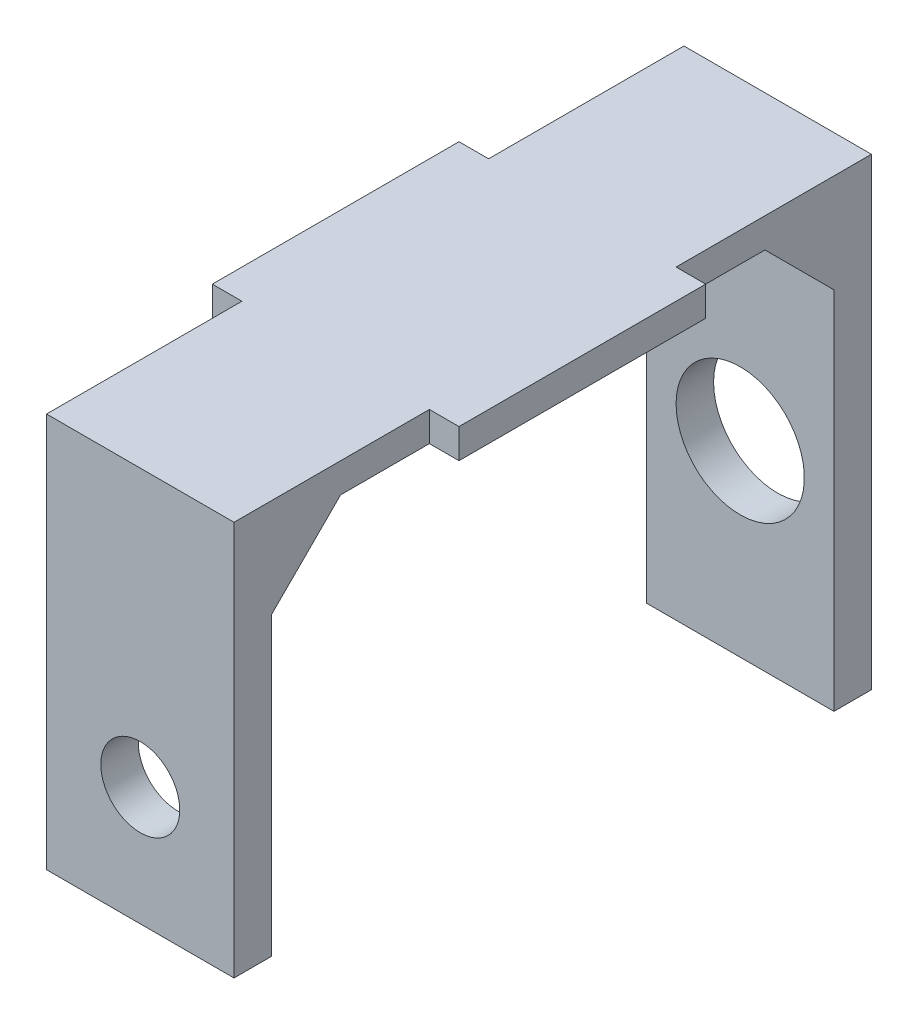
ISO-10303-21;
HEADER;
FILE_DESCRIPTION(('STEP AP214'),'2;1');
FILE_NAME('part.step','',(''),(''),'','','');
FILE_SCHEMA(('AUTOMOTIVE_DESIGN { 1 0 10303 214 1 1 1 1 }'));
ENDSEC;
DATA;
#1=APPLICATION_CONTEXT('core data for automotive mechanical design processes');
#2=APPLICATION_PROTOCOL_DEFINITION('international standard','automotive_design',2000,#1);
#3=PRODUCT_CONTEXT('',#1,'mechanical');
#4=PRODUCT('Part','Part','',(#3));
#5=PRODUCT_RELATED_PRODUCT_CATEGORY('part','',(#4));
#6=PRODUCT_DEFINITION_FORMATION('','',#4);
#7=PRODUCT_DEFINITION_CONTEXT('part definition',#1,'design');
#8=PRODUCT_DEFINITION('design','',#6,#7);
#9=PRODUCT_DEFINITION_SHAPE('','',#8);
#10=(LENGTH_UNIT() NAMED_UNIT(*) SI_UNIT(.MILLI.,.METRE.));
#11=(NAMED_UNIT(*) PLANE_ANGLE_UNIT() SI_UNIT($,.RADIAN.));
#12=(NAMED_UNIT(*) SI_UNIT($,.STERADIAN.) SOLID_ANGLE_UNIT());
#13=UNCERTAINTY_MEASURE_WITH_UNIT(LENGTH_MEASURE(1.E-05),#10,'distance_accuracy_value','');
#14=(GEOMETRIC_REPRESENTATION_CONTEXT(3) GLOBAL_UNCERTAINTY_ASSIGNED_CONTEXT((#13)) GLOBAL_UNIT_ASSIGNED_CONTEXT((#10,
#11,#12)) REPRESENTATION_CONTEXT('',''));
#15=CARTESIAN_POINT('',(0.,0.,0.));
#16=DIRECTION('',(0.,0.,1.));
#17=DIRECTION('',(1.,0.,0.));
#18=AXIS2_PLACEMENT_3D('',#15,#16,#17);
#19=CARTESIAN_POINT('',(0.,50.,0.));
#20=DIRECTION('',(0.,1.,0.));
#21=DIRECTION('',(0.,0.,1.));
#22=AXIS2_PLACEMENT_3D('',#19,#20,#21);
#23=PLANE('',#22);
#24=DIRECTION('',(0.,0.,-1.));
#25=VECTOR('',#24,1.);
#26=CARTESIAN_POINT('',(9.5,50.,3.8));
#27=LINE('',#26,#25);
#28=CARTESIAN_POINT('',(9.5,50.,-6.99999999999966));
#29=VERTEX_POINT('',#28);
#30=CARTESIAN_POINT('',(9.5,50.,-16.));
#31=VERTEX_POINT('',#30);
#32=EDGE_CURVE('E53',#29,#31,#27,.T.);
#33=ORIENTED_EDGE('',*,*,#32,.F.);
#34=DIRECTION('',(1.,0.,0.));
#35=VECTOR('',#34,1.);
#36=CARTESIAN_POINT('',(-9.49999999999999,50.,-6.99999999999966));
#37=LINE('',#36,#35);
#38=CARTESIAN_POINT('',(-9.5,50.,-6.99999999999966));
#39=VERTEX_POINT('',#38);
#40=EDGE_CURVE('E48',#39,#29,#37,.T.);
#41=ORIENTED_EDGE('',*,*,#40,.F.);
#42=DIRECTION('',(0.,0.,1.));
#43=VECTOR('',#42,1.);
#44=CARTESIAN_POINT('',(-9.5,50.,-16.));
#45=LINE('',#44,#43);
#46=CARTESIAN_POINT('',(-9.5,50.,-16.));
#47=VERTEX_POINT('',#46);
#48=EDGE_CURVE('E254',#47,#39,#45,.T.);
#49=ORIENTED_EDGE('',*,*,#48,.F.);
#50=DIRECTION('',(1.,0.,0.));
#51=VECTOR('',#50,1.);
#52=CARTESIAN_POINT('',(-12.5,50.,-16.));
#53=LINE('',#52,#51);
#54=CARTESIAN_POINT('',(-12.5,50.,-16.));
#55=VERTEX_POINT('',#54);
#56=EDGE_CURVE('E252',#55,#47,#53,.T.);
#57=ORIENTED_EDGE('',*,*,#56,.F.);
#58=DIRECTION('',(0.,0.,1.));
#59=VECTOR('',#58,1.);
#60=CARTESIAN_POINT('',(-12.5,50.,-41.));
#61=LINE('',#60,#59);
#62=CARTESIAN_POINT('',(-12.5,50.,-41.));
#63=VERTEX_POINT('',#62);
#64=EDGE_CURVE('E250',#63,#55,#61,.T.);
#65=ORIENTED_EDGE('',*,*,#64,.F.);
#66=DIRECTION('',(-1.,0.,0.));
#67=VECTOR('',#66,1.);
#68=CARTESIAN_POINT('',(-12.5,50.,-41.));
#69=LINE('',#68,#67);
#70=CARTESIAN_POINT('',(-9.5,50.,-41.));
#71=VERTEX_POINT('',#70);
#72=EDGE_CURVE('E248',#71,#63,#69,.T.);
#73=ORIENTED_EDGE('',*,*,#72,.F.);
#74=DIRECTION('',(0.,0.,1.));
#75=VECTOR('',#74,1.);
#76=CARTESIAN_POINT('',(-9.5,50.,-60.8));
#77=LINE('',#76,#75);
#78=CARTESIAN_POINT('',(-9.49999999999999,50.,-49.9999999999997));
#79=VERTEX_POINT('',#78);
#80=EDGE_CURVE('E218',#79,#71,#77,.T.);
#81=ORIENTED_EDGE('',*,*,#80,.F.);
#82=DIRECTION('',(1.,0.,0.));
#83=VECTOR('',#82,1.);
#84=CARTESIAN_POINT('',(-9.49999999999999,50.,-49.9999999999997));
#85=LINE('',#84,#83);
#86=CARTESIAN_POINT('',(9.5,50.,-49.9999999999997));
#87=VERTEX_POINT('',#86);
#88=EDGE_CURVE('E185',#79,#87,#85,.T.);
#89=ORIENTED_EDGE('',*,*,#88,.T.);
#90=DIRECTION('',(0.,0.,-1.));
#91=VECTOR('',#90,1.);
#92=CARTESIAN_POINT('',(9.5,50.,-41.));
#93=LINE('',#92,#91);
#94=CARTESIAN_POINT('',(9.5,50.,-41.));
#95=VERTEX_POINT('',#94);
#96=EDGE_CURVE('E223',#95,#87,#93,.T.);
#97=ORIENTED_EDGE('',*,*,#96,.F.);
#98=DIRECTION('',(-1.,0.,0.));
#99=VECTOR('',#98,1.);
#100=CARTESIAN_POINT('',(9.5,50.,-41.));
#101=LINE('',#100,#99);
#102=CARTESIAN_POINT('',(12.5,50.,-41.));
#103=VERTEX_POINT('',#102);
#104=EDGE_CURVE('E261',#103,#95,#101,.T.);
#105=ORIENTED_EDGE('',*,*,#104,.F.);
#106=DIRECTION('',(0.,0.,-1.));
#107=VECTOR('',#106,1.);
#108=CARTESIAN_POINT('',(12.5,50.,-41.));
#109=LINE('',#108,#107);
#110=CARTESIAN_POINT('',(12.5,50.,-16.));
#111=VERTEX_POINT('',#110);
#112=EDGE_CURVE('E259',#111,#103,#109,.T.);
#113=ORIENTED_EDGE('',*,*,#112,.F.);
#114=DIRECTION('',(1.,0.,0.));
#115=VECTOR('',#114,1.);
#116=CARTESIAN_POINT('',(9.5,50.,-16.));
#117=LINE('',#116,#115);
#118=EDGE_CURVE('E257',#31,#111,#117,.T.);
#119=ORIENTED_EDGE('',*,*,#118,.F.);
#120=EDGE_LOOP('',(#33,#41,#49,#57,#65,#73,#81,#89,#97,#105,#113,#119));
#121=FACE_BOUND('',#120,.T.);
#122=ADVANCED_FACE('F33',(#121),#23,.F.);
#123=CARTESIAN_POINT('',(9.5,50.,-60.8));
#124=DIRECTION('',(0.,0.,1.));
#125=DIRECTION('',(1.,0.,0.));
#126=AXIS2_PLACEMENT_3D('',#123,#124,#125);
#127=PLANE('',#126);
#128=CARTESIAN_POINT('',(0.,25.,-60.8));
#129=DIRECTION('',(0.,0.,-1.));
#130=DIRECTION('',(-1.,0.,0.));
#131=AXIS2_PLACEMENT_3D('',#128,#129,#130);
#132=CIRCLE('',#131,6.5);
#133=CARTESIAN_POINT('',(-6.5,25.,-60.8));
#134=VERTEX_POINT('',#133);
#135=EDGE_CURVE('E214',#134,#134,#132,.T.);
#136=ORIENTED_EDGE('',*,*,#135,.F.);
#137=EDGE_LOOP('',(#136));
#138=FACE_BOUND('',#137,.T.);
#139=DIRECTION('',(0.,-1.,0.));
#140=VECTOR('',#139,1.);
#141=CARTESIAN_POINT('',(9.5,50.,-60.8));
#142=LINE('',#141,#140);
#143=CARTESIAN_POINT('',(9.5,53.,-60.8));
#144=VERTEX_POINT('',#143);
#145=CARTESIAN_POINT('',(9.5,6.00000000000001,-60.8));
#146=VERTEX_POINT('',#145);
#147=EDGE_CURVE('E293',#144,#146,#142,.T.);
#148=ORIENTED_EDGE('',*,*,#147,.T.);
#149=DIRECTION('',(1.,0.,0.));
#150=VECTOR('',#149,1.);
#151=CARTESIAN_POINT('',(9.5,6.00000000000001,-60.8));
#152=LINE('',#151,#150);
#153=CARTESIAN_POINT('',(-9.5,6.00000000000001,-60.8));
#154=VERTEX_POINT('',#153);
#155=EDGE_CURVE('E197',#154,#146,#152,.T.);
#156=ORIENTED_EDGE('',*,*,#155,.F.);
#157=DIRECTION('',(0.,-1.,0.));
#158=VECTOR('',#157,1.);
#159=CARTESIAN_POINT('',(-9.5,50.,-60.8));
#160=LINE('',#159,#158);
#161=CARTESIAN_POINT('',(-9.5,53.,-60.8));
#162=VERTEX_POINT('',#161);
#163=EDGE_CURVE('E41',#162,#154,#160,.T.);
#164=ORIENTED_EDGE('',*,*,#163,.F.);
#165=DIRECTION('',(-1.,0.,0.));
#166=VECTOR('',#165,1.);
#167=CARTESIAN_POINT('',(9.5,53.,-60.8));
#168=LINE('',#167,#166);
#169=EDGE_CURVE('E219',#144,#162,#168,.T.);
#170=ORIENTED_EDGE('',*,*,#169,.F.);
#171=EDGE_LOOP('',(#148,#156,#164,#170));
#172=FACE_BOUND('',#171,.T.);
#173=ADVANCED_FACE('F35',(#138,#172),#127,.F.);
#174=CARTESIAN_POINT('',(-9.5,50.,-60.8));
#175=DIRECTION('',(1.,0.,0.));
#176=DIRECTION('',(0.,0.,-1.));
#177=AXIS2_PLACEMENT_3D('',#174,#175,#176);
#178=PLANE('',#177);
#179=DIRECTION('',(0.,-0.70710678118653,-0.707106781186565));
#180=VECTOR('',#179,1.);
#181=CARTESIAN_POINT('',(-9.49999999999999,43.,-57.));
#182=LINE('',#181,#180);
#183=CARTESIAN_POINT('',(-9.49999999999999,43.,-57.));
#184=VERTEX_POINT('',#183);
#185=EDGE_CURVE('E183',#79,#184,#182,.T.);
#186=ORIENTED_EDGE('',*,*,#185,.F.);
#187=ORIENTED_EDGE('',*,*,#80,.T.);
#188=DIRECTION('',(0.,-1.,0.));
#189=VECTOR('',#188,1.);
#190=CARTESIAN_POINT('',(-9.5,53.,-41.));
#191=LINE('',#190,#189);
#192=CARTESIAN_POINT('',(-9.5,53.,-41.));
#193=VERTEX_POINT('',#192);
#194=EDGE_CURVE('E290',#193,#71,#191,.T.);
#195=ORIENTED_EDGE('',*,*,#194,.F.);
#196=DIRECTION('',(0.,0.,1.));
#197=VECTOR('',#196,1.);
#198=CARTESIAN_POINT('',(-9.5,53.,-60.8));
#199=LINE('',#198,#197);
#200=EDGE_CURVE('E222',#162,#193,#199,.T.);
#201=ORIENTED_EDGE('',*,*,#200,.F.);
#202=ORIENTED_EDGE('',*,*,#163,.T.);
#203=DIRECTION('',(0.,0.,-1.));
#204=VECTOR('',#203,1.);
#205=CARTESIAN_POINT('',(-9.5,6.00000000000001,12.2));
#206=LINE('',#205,#204);
#207=CARTESIAN_POINT('',(-9.5,6.00000000000001,-57.));
#208=VERTEX_POINT('',#207);
#209=EDGE_CURVE('E200',#208,#154,#206,.T.);
#210=ORIENTED_EDGE('',*,*,#209,.F.);
#211=DIRECTION('',(0.,-1.,0.));
#212=VECTOR('',#211,1.);
#213=CARTESIAN_POINT('',(-9.5,50.,-57.));
#214=LINE('',#213,#212);
#215=EDGE_CURVE('E298',#184,#208,#214,.T.);
#216=ORIENTED_EDGE('',*,*,#215,.F.);
#217=EDGE_LOOP('',(#186,#187,#195,#201,#202,#210,#216));
#218=FACE_BOUND('',#217,.T.);
#219=ADVANCED_FACE('F327',(#218),#178,.F.);
#220=CARTESIAN_POINT('',(-9.5,50.,-57.));
#221=DIRECTION('',(0.,0.,-1.));
#222=DIRECTION('',(-1.,0.,0.));
#223=AXIS2_PLACEMENT_3D('',#220,#221,#222);
#224=PLANE('',#223);
#225=CARTESIAN_POINT('',(0.,25.,-57.));
#226=DIRECTION('',(0.,0.,-1.));
#227=DIRECTION('',(-1.,0.,0.));
#228=AXIS2_PLACEMENT_3D('',#225,#226,#227);
#229=CIRCLE('',#228,6.5);
#230=CARTESIAN_POINT('',(-6.5,25.,-57.));
#231=VERTEX_POINT('',#230);
#232=EDGE_CURVE('E167',#231,#231,#229,.T.);
#233=ORIENTED_EDGE('',*,*,#232,.T.);
#234=EDGE_LOOP('',(#233));
#235=FACE_BOUND('',#234,.T.);
#236=DIRECTION('',(0.,-1.,0.));
#237=VECTOR('',#236,1.);
#238=CARTESIAN_POINT('',(9.5,50.,-57.));
#239=LINE('',#238,#237);
#240=CARTESIAN_POINT('',(9.5,43.,-57.));
#241=VERTEX_POINT('',#240);
#242=CARTESIAN_POINT('',(9.5,6.00000000000001,-57.));
#243=VERTEX_POINT('',#242);
#244=EDGE_CURVE('E296',#241,#243,#239,.T.);
#245=ORIENTED_EDGE('',*,*,#244,.F.);
#246=DIRECTION('',(1.,0.,0.));
#247=VECTOR('',#246,1.);
#248=CARTESIAN_POINT('',(-9.49999999999999,43.,-57.));
#249=LINE('',#248,#247);
#250=EDGE_CURVE('E187',#184,#241,#249,.T.);
#251=ORIENTED_EDGE('',*,*,#250,.F.);
#252=ORIENTED_EDGE('',*,*,#215,.T.);
#253=DIRECTION('',(1.,0.,0.));
#254=VECTOR('',#253,1.);
#255=CARTESIAN_POINT('',(-9.5,6.00000000000001,-57.));
#256=LINE('',#255,#254);
#257=EDGE_CURVE('E204',#208,#243,#256,.T.);
#258=ORIENTED_EDGE('',*,*,#257,.T.);
#259=EDGE_LOOP('',(#245,#251,#252,#258));
#260=FACE_BOUND('',#259,.T.);
#261=ADVANCED_FACE('F304',(#235,#260),#224,.F.);
#262=CARTESIAN_POINT('',(9.5,50.,-57.));
#263=DIRECTION('',(-1.,0.,0.));
#264=DIRECTION('',(0.,0.,1.));
#265=AXIS2_PLACEMENT_3D('',#262,#263,#264);
#266=PLANE('',#265);
#267=ORIENTED_EDGE('',*,*,#96,.T.);
#268=DIRECTION('',(0.,-0.70710678118653,-0.707106781186565));
#269=VECTOR('',#268,1.);
#270=CARTESIAN_POINT('',(9.5,43.,-57.));
#271=LINE('',#270,#269);
#272=EDGE_CURVE('E181',#87,#241,#271,.T.);
#273=ORIENTED_EDGE('',*,*,#272,.T.);
#274=ORIENTED_EDGE('',*,*,#244,.T.);
#275=DIRECTION('',(0.,0.,-1.));
#276=VECTOR('',#275,1.);
#277=CARTESIAN_POINT('',(9.5,6.00000000000001,12.2));
#278=LINE('',#277,#276);
#279=EDGE_CURVE('E201',#243,#146,#278,.T.);
#280=ORIENTED_EDGE('',*,*,#279,.T.);
#281=ORIENTED_EDGE('',*,*,#147,.F.);
#282=DIRECTION('',(0.,0.,-1.));
#283=VECTOR('',#282,1.);
#284=CARTESIAN_POINT('',(9.5,53.,-41.));
#285=LINE('',#284,#283);
#286=CARTESIAN_POINT('',(9.5,53.,-41.));
#287=VERTEX_POINT('',#286);
#288=EDGE_CURVE('E243',#287,#144,#285,.T.);
#289=ORIENTED_EDGE('',*,*,#288,.F.);
#290=DIRECTION('',(0.,-1.,0.));
#291=VECTOR('',#290,1.);
#292=CARTESIAN_POINT('',(9.5,53.,-41.));
#293=LINE('',#292,#291);
#294=EDGE_CURVE('E246',#287,#95,#293,.T.);
#295=ORIENTED_EDGE('',*,*,#294,.T.);
#296=EDGE_LOOP('',(#267,#273,#274,#280,#281,#289,#295));
#297=FACE_BOUND('',#296,.T.);
#298=ADVANCED_FACE('F364',(#297),#266,.F.);
#299=CARTESIAN_POINT('',(-12.5,53.,-41.));
#300=DIRECTION('',(0.,0.,1.));
#301=DIRECTION('',(1.,0.,0.));
#302=AXIS2_PLACEMENT_3D('',#299,#300,#301);
#303=PLANE('',#302);
#304=ORIENTED_EDGE('',*,*,#72,.T.);
#305=DIRECTION('',(0.,-1.,0.));
#306=VECTOR('',#305,1.);
#307=CARTESIAN_POINT('',(-12.5,53.,-41.));
#308=LINE('',#307,#306);
#309=CARTESIAN_POINT('',(-12.5,53.,-41.));
#310=VERTEX_POINT('',#309);
#311=EDGE_CURVE('E287',#310,#63,#308,.T.);
#312=ORIENTED_EDGE('',*,*,#311,.F.);
#313=DIRECTION('',(-1.,0.,0.));
#314=VECTOR('',#313,1.);
#315=CARTESIAN_POINT('',(-12.5,53.,-41.));
#316=LINE('',#315,#314);
#317=EDGE_CURVE('E225',#193,#310,#316,.T.);
#318=ORIENTED_EDGE('',*,*,#317,.F.);
#319=ORIENTED_EDGE('',*,*,#194,.T.);
#320=EDGE_LOOP('',(#304,#312,#318,#319));
#321=FACE_BOUND('',#320,.T.);
#322=ADVANCED_FACE('F360',(#321),#303,.F.);
#323=CARTESIAN_POINT('',(-12.5,53.,-41.));
#324=DIRECTION('',(1.,0.,0.));
#325=DIRECTION('',(0.,0.,-1.));
#326=AXIS2_PLACEMENT_3D('',#323,#324,#325);
#327=PLANE('',#326);
#328=ORIENTED_EDGE('',*,*,#64,.T.);
#329=DIRECTION('',(0.,-1.,0.));
#330=VECTOR('',#329,1.);
#331=CARTESIAN_POINT('',(-12.5,53.,-16.));
#332=LINE('',#331,#330);
#333=CARTESIAN_POINT('',(-12.5,53.,-16.));
#334=VERTEX_POINT('',#333);
#335=EDGE_CURVE('E284',#334,#55,#332,.T.);
#336=ORIENTED_EDGE('',*,*,#335,.F.);
#337=DIRECTION('',(0.,0.,1.));
#338=VECTOR('',#337,1.);
#339=CARTESIAN_POINT('',(-12.5,53.,-41.));
#340=LINE('',#339,#338);
#341=EDGE_CURVE('E227',#310,#334,#340,.T.);
#342=ORIENTED_EDGE('',*,*,#341,.F.);
#343=ORIENTED_EDGE('',*,*,#311,.T.);
#344=EDGE_LOOP('',(#328,#336,#342,#343));
#345=FACE_BOUND('',#344,.T.);
#346=ADVANCED_FACE('F356',(#345),#327,.F.);
#347=CARTESIAN_POINT('',(-12.5,53.,-16.));
#348=DIRECTION('',(0.,0.,-1.));
#349=DIRECTION('',(-1.,0.,0.));
#350=AXIS2_PLACEMENT_3D('',#347,#348,#349);
#351=PLANE('',#350);
#352=ORIENTED_EDGE('',*,*,#56,.T.);
#353=DIRECTION('',(0.,-1.,0.));
#354=VECTOR('',#353,1.);
#355=CARTESIAN_POINT('',(-9.5,53.,-16.));
#356=LINE('',#355,#354);
#357=CARTESIAN_POINT('',(-9.5,53.,-16.));
#358=VERTEX_POINT('',#357);
#359=EDGE_CURVE('E281',#358,#47,#356,.T.);
#360=ORIENTED_EDGE('',*,*,#359,.F.);
#361=DIRECTION('',(1.,0.,0.));
#362=VECTOR('',#361,1.);
#363=CARTESIAN_POINT('',(-12.5,53.,-16.));
#364=LINE('',#363,#362);
#365=EDGE_CURVE('E229',#334,#358,#364,.T.);
#366=ORIENTED_EDGE('',*,*,#365,.F.);
#367=ORIENTED_EDGE('',*,*,#335,.T.);
#368=EDGE_LOOP('',(#352,#360,#366,#367));
#369=FACE_BOUND('',#368,.T.);
#370=ADVANCED_FACE('F352',(#369),#351,.F.);
#371=CARTESIAN_POINT('',(-9.5,53.,-16.));
#372=DIRECTION('',(1.,0.,0.));
#373=DIRECTION('',(0.,0.,-1.));
#374=AXIS2_PLACEMENT_3D('',#371,#372,#373);
#375=PLANE('',#374);
#376=ORIENTED_EDGE('',*,*,#48,.T.);
#377=DIRECTION('',(0.,0.707106781186564,-0.707106781186531));
#378=VECTOR('',#377,1.);
#379=CARTESIAN_POINT('',(-9.49999999999999,43.,0.));
#380=LINE('',#379,#378);
#381=CARTESIAN_POINT('',(-9.5,43.,0.));
#382=VERTEX_POINT('',#381);
#383=EDGE_CURVE('E175',#382,#39,#380,.T.);
#384=ORIENTED_EDGE('',*,*,#383,.F.);
#385=DIRECTION('',(0.,-1.,0.));
#386=VECTOR('',#385,1.);
#387=CARTESIAN_POINT('',(-9.5,50.,0.));
#388=LINE('',#387,#386);
#389=CARTESIAN_POINT('',(-9.5,13.,0.));
#390=VERTEX_POINT('',#389);
#391=EDGE_CURVE('E166',#382,#390,#388,.T.);
#392=ORIENTED_EDGE('',*,*,#391,.T.);
#393=DIRECTION('',(0.,0.,1.));
#394=VECTOR('',#393,1.);
#395=CARTESIAN_POINT('',(-9.5,13.,-5.19999999999999));
#396=LINE('',#395,#394);
#397=CARTESIAN_POINT('',(-9.5,13.,3.8));
#398=VERTEX_POINT('',#397);
#399=EDGE_CURVE('E194',#390,#398,#396,.T.);
#400=ORIENTED_EDGE('',*,*,#399,.T.);
#401=DIRECTION('',(0.,-1.,0.));
#402=VECTOR('',#401,1.);
#403=CARTESIAN_POINT('',(-9.5,53.,3.8));
#404=LINE('',#403,#402);
#405=CARTESIAN_POINT('',(-9.5,53.,3.8));
#406=VERTEX_POINT('',#405);
#407=EDGE_CURVE('E278',#406,#398,#404,.T.);
#408=ORIENTED_EDGE('',*,*,#407,.F.);
#409=DIRECTION('',(0.,0.,1.));
#410=VECTOR('',#409,1.);
#411=CARTESIAN_POINT('',(-9.5,53.,-16.));
#412=LINE('',#411,#410);
#413=EDGE_CURVE('E231',#358,#406,#412,.T.);
#414=ORIENTED_EDGE('',*,*,#413,.F.);
#415=ORIENTED_EDGE('',*,*,#359,.T.);
#416=EDGE_LOOP('',(#376,#384,#392,#400,#408,#414,#415));
#417=FACE_BOUND('',#416,.T.);
#418=ADVANCED_FACE('F348',(#417),#375,.F.);
#419=CARTESIAN_POINT('',(-9.5,53.,3.8));
#420=DIRECTION('',(0.,0.,-1.));
#421=DIRECTION('',(-1.,0.,0.));
#422=AXIS2_PLACEMENT_3D('',#419,#420,#421);
#423=PLANE('',#422);
#424=CARTESIAN_POINT('',(0.,25.,3.8));
#425=DIRECTION('',(0.,0.,-1.));
#426=DIRECTION('',(-1.,0.,0.));
#427=AXIS2_PLACEMENT_3D('',#424,#425,#426);
#428=CIRCLE('',#427,4.);
#429=CARTESIAN_POINT('',(-4.,25.,3.8));
#430=VERTEX_POINT('',#429);
#431=EDGE_CURVE('E211',#430,#430,#428,.T.);
#432=ORIENTED_EDGE('',*,*,#431,.T.);
#433=EDGE_LOOP('',(#432));
#434=FACE_BOUND('',#433,.T.);
#435=ORIENTED_EDGE('',*,*,#407,.T.);
#436=DIRECTION('',(-1.,0.,0.));
#437=VECTOR('',#436,1.);
#438=CARTESIAN_POINT('',(-9.5,13.,3.8));
#439=LINE('',#438,#437);
#440=CARTESIAN_POINT('',(9.5,13.,3.8));
#441=VERTEX_POINT('',#440);
#442=EDGE_CURVE('E190',#441,#398,#439,.T.);
#443=ORIENTED_EDGE('',*,*,#442,.F.);
#444=DIRECTION('',(0.,-1.,0.));
#445=VECTOR('',#444,1.);
#446=CARTESIAN_POINT('',(9.5,53.,3.8));
#447=LINE('',#446,#445);
#448=CARTESIAN_POINT('',(9.5,53.,3.8));
#449=VERTEX_POINT('',#448);
#450=EDGE_CURVE('E276',#449,#441,#447,.T.);
#451=ORIENTED_EDGE('',*,*,#450,.F.);
#452=DIRECTION('',(1.,0.,0.));
#453=VECTOR('',#452,1.);
#454=CARTESIAN_POINT('',(-9.5,53.,3.8));
#455=LINE('',#454,#453);
#456=EDGE_CURVE('E233',#406,#449,#455,.T.);
#457=ORIENTED_EDGE('',*,*,#456,.F.);
#458=EDGE_LOOP('',(#435,#443,#451,#457));
#459=FACE_BOUND('',#458,.T.);
#460=ADVANCED_FACE('F345',(#434,#459),#423,.F.);
#461=CARTESIAN_POINT('',(9.5,53.,3.8));
#462=DIRECTION('',(-1.,0.,0.));
#463=DIRECTION('',(0.,0.,1.));
#464=AXIS2_PLACEMENT_3D('',#461,#462,#463);
#465=PLANE('',#464);
#466=DIRECTION('',(0.,0.707106781186564,-0.707106781186531));
#467=VECTOR('',#466,1.);
#468=CARTESIAN_POINT('',(9.5,43.,0.));
#469=LINE('',#468,#467);
#470=CARTESIAN_POINT('',(9.5,43.,0.));
#471=VERTEX_POINT('',#470);
#472=EDGE_CURVE('E161',#471,#29,#469,.T.);
#473=ORIENTED_EDGE('',*,*,#472,.T.);
#474=ORIENTED_EDGE('',*,*,#32,.T.);
#475=DIRECTION('',(0.,-1.,0.));
#476=VECTOR('',#475,1.);
#477=CARTESIAN_POINT('',(9.5,53.,-16.));
#478=LINE('',#477,#476);
#479=CARTESIAN_POINT('',(9.5,53.,-16.));
#480=VERTEX_POINT('',#479);
#481=EDGE_CURVE('E273',#480,#31,#478,.T.);
#482=ORIENTED_EDGE('',*,*,#481,.F.);
#483=DIRECTION('',(0.,0.,-1.));
#484=VECTOR('',#483,1.);
#485=CARTESIAN_POINT('',(9.5,53.,3.8));
#486=LINE('',#485,#484);
#487=EDGE_CURVE('E235',#449,#480,#486,.T.);
#488=ORIENTED_EDGE('',*,*,#487,.F.);
#489=ORIENTED_EDGE('',*,*,#450,.T.);
#490=DIRECTION('',(0.,0.,1.));
#491=VECTOR('',#490,1.);
#492=CARTESIAN_POINT('',(9.5,13.,-5.19999999999999));
#493=LINE('',#492,#491);
#494=CARTESIAN_POINT('',(9.5,13.,0.));
#495=VERTEX_POINT('',#494);
#496=EDGE_CURVE('E163',#495,#441,#493,.T.);
#497=ORIENTED_EDGE('',*,*,#496,.F.);
#498=DIRECTION('',(0.,-1.,0.));
#499=VECTOR('',#498,1.);
#500=CARTESIAN_POINT('',(9.5,50.,0.));
#501=LINE('',#500,#499);
#502=EDGE_CURVE('E157',#471,#495,#501,.T.);
#503=ORIENTED_EDGE('',*,*,#502,.F.);
#504=EDGE_LOOP('',(#473,#474,#482,#488,#489,#497,#503));
#505=FACE_BOUND('',#504,.T.);
#506=ADVANCED_FACE('F159',(#505),#465,.F.);
#507=CARTESIAN_POINT('',(9.5,53.,-16.));
#508=DIRECTION('',(0.,0.,-1.));
#509=DIRECTION('',(-1.,0.,0.));
#510=AXIS2_PLACEMENT_3D('',#507,#508,#509);
#511=PLANE('',#510);
#512=ORIENTED_EDGE('',*,*,#118,.T.);
#513=DIRECTION('',(0.,-1.,0.));
#514=VECTOR('',#513,1.);
#515=CARTESIAN_POINT('',(12.5,53.,-16.));
#516=LINE('',#515,#514);
#517=CARTESIAN_POINT('',(12.5,53.,-16.));
#518=VERTEX_POINT('',#517);
#519=EDGE_CURVE('E270',#518,#111,#516,.T.);
#520=ORIENTED_EDGE('',*,*,#519,.F.);
#521=DIRECTION('',(1.,0.,0.));
#522=VECTOR('',#521,1.);
#523=CARTESIAN_POINT('',(9.5,53.,-16.));
#524=LINE('',#523,#522);
#525=EDGE_CURVE('E237',#480,#518,#524,.T.);
#526=ORIENTED_EDGE('',*,*,#525,.F.);
#527=ORIENTED_EDGE('',*,*,#481,.T.);
#528=EDGE_LOOP('',(#512,#520,#526,#527));
#529=FACE_BOUND('',#528,.T.);
#530=ADVANCED_FACE('F338',(#529),#511,.F.);
#531=CARTESIAN_POINT('',(12.5,53.,-41.));
#532=DIRECTION('',(-1.,0.,0.));
#533=DIRECTION('',(0.,0.,1.));
#534=AXIS2_PLACEMENT_3D('',#531,#532,#533);
#535=PLANE('',#534);
#536=ORIENTED_EDGE('',*,*,#112,.T.);
#537=DIRECTION('',(0.,-1.,0.));
#538=VECTOR('',#537,1.);
#539=CARTESIAN_POINT('',(12.5,53.,-41.));
#540=LINE('',#539,#538);
#541=CARTESIAN_POINT('',(12.5,53.,-41.));
#542=VERTEX_POINT('',#541);
#543=EDGE_CURVE('E267',#542,#103,#540,.T.);
#544=ORIENTED_EDGE('',*,*,#543,.F.);
#545=DIRECTION('',(0.,0.,-1.));
#546=VECTOR('',#545,1.);
#547=CARTESIAN_POINT('',(12.5,53.,-41.));
#548=LINE('',#547,#546);
#549=EDGE_CURVE('E239',#518,#542,#548,.T.);
#550=ORIENTED_EDGE('',*,*,#549,.F.);
#551=ORIENTED_EDGE('',*,*,#519,.T.);
#552=EDGE_LOOP('',(#536,#544,#550,#551));
#553=FACE_BOUND('',#552,.T.);
#554=ADVANCED_FACE('F334',(#553),#535,.F.);
#555=CARTESIAN_POINT('',(9.5,53.,-41.));
#556=DIRECTION('',(0.,0.,1.));
#557=DIRECTION('',(1.,0.,0.));
#558=AXIS2_PLACEMENT_3D('',#555,#556,#557);
#559=PLANE('',#558);
#560=ORIENTED_EDGE('',*,*,#104,.T.);
#561=ORIENTED_EDGE('',*,*,#294,.F.);
#562=DIRECTION('',(-1.,0.,0.));
#563=VECTOR('',#562,1.);
#564=CARTESIAN_POINT('',(9.5,53.,-41.));
#565=LINE('',#564,#563);
#566=EDGE_CURVE('E241',#542,#287,#565,.T.);
#567=ORIENTED_EDGE('',*,*,#566,.F.);
#568=ORIENTED_EDGE('',*,*,#543,.T.);
#569=EDGE_LOOP('',(#560,#561,#567,#568));
#570=FACE_BOUND('',#569,.T.);
#571=ADVANCED_FACE('F331',(#570),#559,.F.);
#572=CARTESIAN_POINT('',(0.,53.,0.));
#573=DIRECTION('',(0.,1.,0.));
#574=DIRECTION('',(0.,0.,1.));
#575=AXIS2_PLACEMENT_3D('',#572,#573,#574);
#576=PLANE('',#575);
#577=ORIENTED_EDGE('',*,*,#169,.T.);
#578=ORIENTED_EDGE('',*,*,#200,.T.);
#579=ORIENTED_EDGE('',*,*,#317,.T.);
#580=ORIENTED_EDGE('',*,*,#341,.T.);
#581=ORIENTED_EDGE('',*,*,#365,.T.);
#582=ORIENTED_EDGE('',*,*,#413,.T.);
#583=ORIENTED_EDGE('',*,*,#456,.T.);
#584=ORIENTED_EDGE('',*,*,#487,.T.);
#585=ORIENTED_EDGE('',*,*,#525,.T.);
#586=ORIENTED_EDGE('',*,*,#549,.T.);
#587=ORIENTED_EDGE('',*,*,#566,.T.);
#588=ORIENTED_EDGE('',*,*,#288,.T.);
#589=EDGE_LOOP('',(#577,#578,#579,#580,#581,#582,#583,#584,#585,#586,#587,#588));
#590=FACE_BOUND('',#589,.T.);
#591=ADVANCED_FACE('F319',(#590),#576,.T.);
#592=CARTESIAN_POINT('',(9.5,50.,0.));
#593=DIRECTION('',(0.,0.,1.));
#594=DIRECTION('',(1.,0.,0.));
#595=AXIS2_PLACEMENT_3D('',#592,#593,#594);
#596=PLANE('',#595);
#597=CARTESIAN_POINT('',(0.,25.,0.));
#598=DIRECTION('',(0.,0.,-1.));
#599=DIRECTION('',(-1.,0.,0.));
#600=AXIS2_PLACEMENT_3D('',#597,#598,#599);
#601=CIRCLE('',#600,4.);
#602=CARTESIAN_POINT('',(-4.,25.,0.));
#603=VERTEX_POINT('',#602);
#604=EDGE_CURVE('E208',#603,#603,#601,.T.);
#605=ORIENTED_EDGE('',*,*,#604,.F.);
#606=EDGE_LOOP('',(#605));
#607=FACE_BOUND('',#606,.T.);
#608=ORIENTED_EDGE('',*,*,#391,.F.);
#609=DIRECTION('',(1.,0.,0.));
#610=VECTOR('',#609,1.);
#611=CARTESIAN_POINT('',(-9.49999999999999,43.,0.));
#612=LINE('',#611,#610);
#613=EDGE_CURVE('E170',#382,#471,#612,.T.);
#614=ORIENTED_EDGE('',*,*,#613,.T.);
#615=ORIENTED_EDGE('',*,*,#502,.T.);
#616=DIRECTION('',(-1.,0.,0.));
#617=VECTOR('',#616,1.);
#618=CARTESIAN_POINT('',(9.5,13.,0.));
#619=LINE('',#618,#617);
#620=EDGE_CURVE('E11',#495,#390,#619,.T.);
#621=ORIENTED_EDGE('',*,*,#620,.T.);
#622=EDGE_LOOP('',(#608,#614,#615,#621));
#623=FACE_BOUND('',#622,.T.);
#624=ADVANCED_FACE('F171',(#607,#623),#596,.F.);
#625=CARTESIAN_POINT('',(0.,25.,-55.8));
#626=DIRECTION('',(0.,0.,-1.));
#627=DIRECTION('',(-1.,0.,0.));
#628=AXIS2_PLACEMENT_3D('',#625,#626,#627);
#629=CYLINDRICAL_SURFACE('',#628,6.5);
#630=ORIENTED_EDGE('',*,*,#135,.T.);
#631=EDGE_LOOP('',(#630));
#632=FACE_BOUND('',#631,.T.);
#633=ORIENTED_EDGE('',*,*,#232,.F.);
#634=EDGE_LOOP('',(#633));
#635=FACE_BOUND('',#634,.T.);
#636=ADVANCED_FACE('F307',(#632,#635),#629,.F.);
#637=CARTESIAN_POINT('',(0.,25.,5.));
#638=DIRECTION('',(0.,0.,-1.));
#639=DIRECTION('',(-1.,0.,0.));
#640=AXIS2_PLACEMENT_3D('',#637,#638,#639);
#641=CYLINDRICAL_SURFACE('',#640,4.);
#642=ORIENTED_EDGE('',*,*,#604,.T.);
#643=EDGE_LOOP('',(#642));
#644=FACE_BOUND('',#643,.T.);
#645=ORIENTED_EDGE('',*,*,#431,.F.);
#646=EDGE_LOOP('',(#645));
#647=FACE_BOUND('',#646,.T.);
#648=ADVANCED_FACE('F309',(#644,#647),#641,.F.);
#649=CARTESIAN_POINT('',(9.5,6.00000000000001,12.2));
#650=DIRECTION('',(0.,1.,0.));
#651=DIRECTION('',(0.,0.,1.));
#652=AXIS2_PLACEMENT_3D('',#649,#650,#651);
#653=PLANE('',#652);
#654=ORIENTED_EDGE('',*,*,#209,.T.);
#655=ORIENTED_EDGE('',*,*,#155,.T.);
#656=ORIENTED_EDGE('',*,*,#279,.F.);
#657=ORIENTED_EDGE('',*,*,#257,.F.);
#658=EDGE_LOOP('',(#654,#655,#656,#657));
#659=FACE_BOUND('',#658,.T.);
#660=ADVANCED_FACE('F316',(#659),#653,.F.);
#661=CARTESIAN_POINT('',(-9.5,13.,-5.19999999999999));
#662=DIRECTION('',(0.,1.,0.));
#663=DIRECTION('',(0.,0.,1.));
#664=AXIS2_PLACEMENT_3D('',#661,#662,#663);
#665=PLANE('',#664);
#666=ORIENTED_EDGE('',*,*,#496,.T.);
#667=ORIENTED_EDGE('',*,*,#442,.T.);
#668=ORIENTED_EDGE('',*,*,#399,.F.);
#669=ORIENTED_EDGE('',*,*,#620,.F.);
#670=EDGE_LOOP('',(#666,#667,#668,#669));
#671=FACE_BOUND('',#670,.T.);
#672=ADVANCED_FACE('F403',(#671),#665,.F.);
#673=CARTESIAN_POINT('',(-9.49999999999999,43.,-57.));
#674=DIRECTION('',(0.,-0.707106781186565,0.70710678118653));
#675=DIRECTION('',(0.,-0.70710678118653,-0.707106781186565));
#676=AXIS2_PLACEMENT_3D('',#673,#674,#675);
#677=PLANE('',#676);
#678=ORIENTED_EDGE('',*,*,#272,.F.);
#679=ORIENTED_EDGE('',*,*,#88,.F.);
#680=ORIENTED_EDGE('',*,*,#185,.T.);
#681=ORIENTED_EDGE('',*,*,#250,.T.);
#682=EDGE_LOOP('',(#678,#679,#680,#681));
#683=FACE_BOUND('',#682,.T.);
#684=ADVANCED_FACE('F401',(#683),#677,.T.);
#685=CARTESIAN_POINT('',(-9.49999999999999,43.,0.));
#686=DIRECTION('',(0.,-0.707106781186531,-0.707106781186564));
#687=DIRECTION('',(0.,0.707106781186564,-0.707106781186531));
#688=AXIS2_PLACEMENT_3D('',#685,#686,#687);
#689=PLANE('',#688);
#690=ORIENTED_EDGE('',*,*,#472,.F.);
#691=ORIENTED_EDGE('',*,*,#613,.F.);
#692=ORIENTED_EDGE('',*,*,#383,.T.);
#693=ORIENTED_EDGE('',*,*,#40,.T.);
#694=EDGE_LOOP('',(#690,#691,#692,#693));
#695=FACE_BOUND('',#694,.T.);
#696=ADVANCED_FACE('F177',(#695),#689,.T.);
#697=CLOSED_SHELL('',(#122,#173,#219,#261,#298,#322,#346,#370,#418,#460,#506,#530,#554,#571,
#591,#624,#636,#648,#660,#672,#684,#696));
#698=MANIFOLD_SOLID_BREP('B2',#697);
#699=ADVANCED_BREP_SHAPE_REPRESENTATION('',(#18,#698),#14);
#700=SHAPE_DEFINITION_REPRESENTATION(#9,#699);
ENDSEC;
END-ISO-10303-21;
